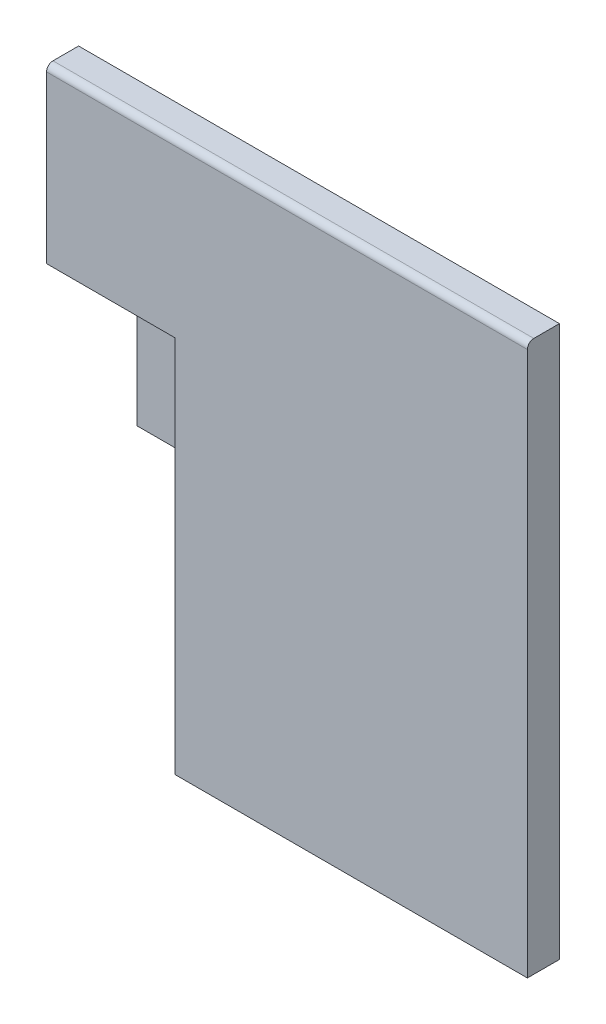
ISO-10303-21;
HEADER;
FILE_DESCRIPTION(('STEP AP214'),'2;1');
FILE_NAME('part.step','',(''),(''),'','','');
FILE_SCHEMA(('AUTOMOTIVE_DESIGN { 1 0 10303 214 1 1 1 1 }'));
ENDSEC;
DATA;
#1=APPLICATION_CONTEXT('core data for automotive mechanical design processes');
#2=APPLICATION_PROTOCOL_DEFINITION('international standard','automotive_design',2000,#1);
#3=PRODUCT_CONTEXT('',#1,'mechanical');
#4=PRODUCT('Part','Part','',(#3));
#5=PRODUCT_RELATED_PRODUCT_CATEGORY('part','',(#4));
#6=PRODUCT_DEFINITION_FORMATION('','',#4);
#7=PRODUCT_DEFINITION_CONTEXT('part definition',#1,'design');
#8=PRODUCT_DEFINITION('design','',#6,#7);
#9=PRODUCT_DEFINITION_SHAPE('','',#8);
#10=(LENGTH_UNIT() NAMED_UNIT(*) SI_UNIT(.MILLI.,.METRE.));
#11=(NAMED_UNIT(*) PLANE_ANGLE_UNIT() SI_UNIT($,.RADIAN.));
#12=(NAMED_UNIT(*) SI_UNIT($,.STERADIAN.) SOLID_ANGLE_UNIT());
#13=UNCERTAINTY_MEASURE_WITH_UNIT(LENGTH_MEASURE(1.E-05),#10,'distance_accuracy_value','');
#14=(GEOMETRIC_REPRESENTATION_CONTEXT(3) GLOBAL_UNCERTAINTY_ASSIGNED_CONTEXT((#13)) GLOBAL_UNIT_ASSIGNED_CONTEXT((#10,
#11,#12)) REPRESENTATION_CONTEXT('',''));
#15=CARTESIAN_POINT('',(0.,0.,0.));
#16=DIRECTION('',(0.,0.,1.));
#17=DIRECTION('',(1.,0.,0.));
#18=AXIS2_PLACEMENT_3D('',#15,#16,#17);
#19=CARTESIAN_POINT('',(0.,0.,-33.2842712474619));
#20=DIRECTION('',(0.,1.,0.));
#21=DIRECTION('',(0.,0.,-1.));
#22=AXIS2_PLACEMENT_3D('',#19,#20,#21);
#23=PLANE('',#22);
#24=DIRECTION('',(-1.,0.,0.));
#25=VECTOR('',#24,1.);
#26=CARTESIAN_POINT('',(75.,0.,-19.1421356237309));
#27=LINE('',#26,#25);
#28=CARTESIAN_POINT('',(30.0000000000001,0.,-19.1421356237309));
#29=VERTEX_POINT('',#28);
#30=CARTESIAN_POINT('',(20.,0.,-19.1421356237309));
#31=VERTEX_POINT('',#30);
#32=EDGE_CURVE('E11',#29,#31,#27,.T.);
#33=ORIENTED_EDGE('',*,*,#32,.T.);
#34=DIRECTION('',(0.,0.,-1.));
#35=VECTOR('',#34,1.);
#36=CARTESIAN_POINT('',(20.,0.,-14.142135623731));
#37=LINE('',#36,#35);
#38=CARTESIAN_POINT('',(20.,0.,-28.2842712474619));
#39=VERTEX_POINT('',#38);
#40=EDGE_CURVE('E189',#31,#39,#37,.T.);
#41=ORIENTED_EDGE('',*,*,#40,.T.);
#42=DIRECTION('',(1.,0.,0.));
#43=VECTOR('',#42,1.);
#44=CARTESIAN_POINT('',(0.,0.,-28.2842712474619));
#45=LINE('',#44,#43);
#46=CARTESIAN_POINT('',(0.,0.,-28.2842712474619));
#47=VERTEX_POINT('',#46);
#48=EDGE_CURVE('E210',#47,#39,#45,.T.);
#49=ORIENTED_EDGE('',*,*,#48,.F.);
#50=DIRECTION('',(0.,0.,1.));
#51=VECTOR('',#50,1.);
#52=CARTESIAN_POINT('',(0.,0.,-33.2842712474619));
#53=LINE('',#52,#51);
#54=CARTESIAN_POINT('',(0.,0.,-33.2842712474619));
#55=VERTEX_POINT('',#54);
#56=EDGE_CURVE('E207',#55,#47,#53,.T.);
#57=ORIENTED_EDGE('',*,*,#56,.F.);
#58=DIRECTION('',(1.,0.,0.));
#59=VECTOR('',#58,1.);
#60=CARTESIAN_POINT('',(0.,0.,-33.2842712474619));
#61=LINE('',#60,#59);
#62=CARTESIAN_POINT('',(25.,0.,-33.2842712474619));
#63=VERTEX_POINT('',#62);
#64=EDGE_CURVE('E196',#55,#63,#61,.T.);
#65=ORIENTED_EDGE('',*,*,#64,.T.);
#66=DIRECTION('',(0.,0.,1.));
#67=VECTOR('',#66,1.);
#68=CARTESIAN_POINT('',(25.,0.,-33.2842712474619));
#69=LINE('',#68,#67);
#70=CARTESIAN_POINT('',(25.,0.,-24.1421356237309));
#71=VERTEX_POINT('',#70);
#72=EDGE_CURVE('E223',#63,#71,#69,.T.);
#73=ORIENTED_EDGE('',*,*,#72,.T.);
#74=DIRECTION('',(-0.707106781186552,0.,-0.707106781186543));
#75=VECTOR('',#74,1.);
#76=CARTESIAN_POINT('',(7.92893218813437,0.,-41.2132034355964));
#77=LINE('',#76,#75);
#78=EDGE_CURVE('E234',#29,#71,#77,.T.);
#79=ORIENTED_EDGE('',*,*,#78,.F.);
#80=EDGE_LOOP('',(#33,#41,#49,#57,#65,#73,#79));
#81=FACE_BOUND('',#80,.T.);
#82=ADVANCED_FACE('F43',(#81),#23,.F.);
#83=CARTESIAN_POINT('',(0.,0.,-28.2842712474619));
#84=DIRECTION('',(0.,0.,-1.));
#85=DIRECTION('',(1.,0.,0.));
#86=AXIS2_PLACEMENT_3D('',#83,#84,#85);
#87=PLANE('',#86);
#88=CARTESIAN_POINT('',(10.,10.,-28.2842712474619));
#89=DIRECTION('',(0.,0.,1.));
#90=DIRECTION('',(1.,0.,0.));
#91=AXIS2_PLACEMENT_3D('',#88,#89,#90);
#92=CIRCLE('',#91,2.65);
#93=CARTESIAN_POINT('',(12.65,10.,-28.2842712474619));
#94=VERTEX_POINT('',#93);
#95=EDGE_CURVE('E192',#94,#94,#92,.T.);
#96=ORIENTED_EDGE('',*,*,#95,.F.);
#97=EDGE_LOOP('',(#96));
#98=FACE_BOUND('',#97,.T.);
#99=DIRECTION('',(0.,1.,0.));
#100=VECTOR('',#99,1.);
#101=CARTESIAN_POINT('',(20.,15.,-28.2842712474619));
#102=LINE('',#101,#100);
#103=CARTESIAN_POINT('',(20.,15.,-28.2842712474619));
#104=VERTEX_POINT('',#103);
#105=EDGE_CURVE('E176',#39,#104,#102,.T.);
#106=ORIENTED_EDGE('',*,*,#105,.T.);
#107=DIRECTION('',(1.,0.,0.));
#108=VECTOR('',#107,1.);
#109=CARTESIAN_POINT('',(0.,15.,-28.2842712474619));
#110=LINE('',#109,#108);
#111=CARTESIAN_POINT('',(0.,15.,-28.2842712474619));
#112=VERTEX_POINT('',#111);
#113=EDGE_CURVE('E213',#112,#104,#110,.T.);
#114=ORIENTED_EDGE('',*,*,#113,.F.);
#115=DIRECTION('',(0.,1.,0.));
#116=VECTOR('',#115,1.);
#117=CARTESIAN_POINT('',(0.,0.,-28.2842712474619));
#118=LINE('',#117,#116);
#119=EDGE_CURVE('E197',#47,#112,#118,.T.);
#120=ORIENTED_EDGE('',*,*,#119,.F.);
#121=ORIENTED_EDGE('',*,*,#48,.T.);
#122=EDGE_LOOP('',(#106,#114,#120,#121));
#123=FACE_BOUND('',#122,.T.);
#124=ADVANCED_FACE('F314',(#98,#123),#87,.F.);
#125=CARTESIAN_POINT('',(25.,0.,-33.2842712474619));
#126=DIRECTION('',(1.,0.,0.));
#127=DIRECTION('',(0.,1.,0.));
#128=AXIS2_PLACEMENT_3D('',#125,#126,#127);
#129=PLANE('',#128);
#130=ORIENTED_EDGE('',*,*,#72,.F.);
#131=DIRECTION('',(0.,-1.,0.));
#132=VECTOR('',#131,1.);
#133=CARTESIAN_POINT('',(25.,0.,-33.2842712474619));
#134=LINE('',#133,#132);
#135=CARTESIAN_POINT('',(25.,15.,-33.2842712474619));
#136=VERTEX_POINT('',#135);
#137=EDGE_CURVE('E200',#136,#63,#134,.T.);
#138=ORIENTED_EDGE('',*,*,#137,.F.);
#139=DIRECTION('',(0.,0.703526470681449,0.710669054518701));
#140=VECTOR('',#139,1.);
#141=CARTESIAN_POINT('',(25.,29.,-19.142135623731));
#142=LINE('',#141,#140);
#143=CARTESIAN_POINT('',(25.,29.,-19.142135623731));
#144=VERTEX_POINT('',#143);
#145=EDGE_CURVE('E279',#136,#144,#142,.T.);
#146=ORIENTED_EDGE('',*,*,#145,.T.);
#147=DIRECTION('',(0.,-1.,0.));
#148=VECTOR('',#147,1.);
#149=CARTESIAN_POINT('',(25.,15.,-19.142135623731));
#150=LINE('',#149,#148);
#151=CARTESIAN_POINT('',(25.,24.0502525316942,-19.142135623731));
#152=VERTEX_POINT('',#151);
#153=EDGE_CURVE('E226',#144,#152,#150,.T.);
#154=ORIENTED_EDGE('',*,*,#153,.T.);
#155=DIRECTION('',(0.,-0.703526470681449,-0.710669054518701));
#156=VECTOR('',#155,1.);
#157=CARTESIAN_POINT('',(25.,15.,-28.2842712474619));
#158=LINE('',#157,#156);
#159=CARTESIAN_POINT('',(25.,15.,-28.2842712474619));
#160=VERTEX_POINT('',#159);
#161=EDGE_CURVE('E276',#152,#160,#158,.T.);
#162=ORIENTED_EDGE('',*,*,#161,.T.);
#163=DIRECTION('',(0.,0.,1.));
#164=VECTOR('',#163,1.);
#165=CARTESIAN_POINT('',(25.,15.,-33.2842712474619));
#166=LINE('',#165,#164);
#167=CARTESIAN_POINT('',(25.,15.,-24.1421356237309));
#168=VERTEX_POINT('',#167);
#169=EDGE_CURVE('E220',#160,#168,#166,.T.);
#170=ORIENTED_EDGE('',*,*,#169,.T.);
#171=DIRECTION('',(0.,1.,0.));
#172=VECTOR('',#171,1.);
#173=CARTESIAN_POINT('',(25.,0.,-24.1421356237309));
#174=LINE('',#173,#172);
#175=EDGE_CURVE('E231',#71,#168,#174,.T.);
#176=ORIENTED_EDGE('',*,*,#175,.F.);
#177=EDGE_LOOP('',(#130,#138,#146,#154,#162,#170,#176));
#178=FACE_BOUND('',#177,.T.);
#179=ADVANCED_FACE('F307',(#178),#129,.T.);
#180=CARTESIAN_POINT('',(0.,15.,-33.2842712474619));
#181=DIRECTION('',(0.,1.,0.));
#182=DIRECTION('',(0.,0.,-1.));
#183=AXIS2_PLACEMENT_3D('',#180,#181,#182);
#184=PLANE('',#183);
#185=DIRECTION('',(-1.,0.,0.));
#186=VECTOR('',#185,1.);
#187=CARTESIAN_POINT('',(48.7154244372162,15.,-28.2842712474619));
#188=LINE('',#187,#186);
#189=EDGE_CURVE('E273',#160,#104,#188,.T.);
#190=ORIENTED_EDGE('',*,*,#189,.T.);
#191=DIRECTION('',(0.,0.,-1.));
#192=VECTOR('',#191,1.);
#193=CARTESIAN_POINT('',(20.,15.,-14.142135623731));
#194=LINE('',#193,#192);
#195=CARTESIAN_POINT('',(20.,15.,-19.142135623731));
#196=VERTEX_POINT('',#195);
#197=EDGE_CURVE('E186',#196,#104,#194,.T.);
#198=ORIENTED_EDGE('',*,*,#197,.F.);
#199=DIRECTION('',(1.,0.,0.));
#200=VECTOR('',#199,1.);
#201=CARTESIAN_POINT('',(20.,15.,-19.142135623731));
#202=LINE('',#201,#200);
#203=CARTESIAN_POINT('',(30.,15.,-19.142135623731));
#204=VERTEX_POINT('',#203);
#205=EDGE_CURVE('E248',#196,#204,#202,.T.);
#206=ORIENTED_EDGE('',*,*,#205,.T.);
#207=DIRECTION('',(0.707106781186552,0.,0.707106781186543));
#208=VECTOR('',#207,1.);
#209=CARTESIAN_POINT('',(30.,15.,-19.142135623731));
#210=LINE('',#209,#208);
#211=EDGE_CURVE('E237',#168,#204,#210,.T.);
#212=ORIENTED_EDGE('',*,*,#211,.F.);
#213=ORIENTED_EDGE('',*,*,#169,.F.);
#214=EDGE_LOOP('',(#190,#198,#206,#212,#213));
#215=FACE_BOUND('',#214,.T.);
#216=ADVANCED_FACE('F304',(#215),#184,.T.);
#217=CARTESIAN_POINT('',(10.,10.,-33.2842712474619));
#218=DIRECTION('',(0.,0.,1.));
#219=DIRECTION('',(-1.,0.,0.));
#220=AXIS2_PLACEMENT_3D('',#217,#218,#219);
#221=CYLINDRICAL_SURFACE('',#220,2.65);
#222=CARTESIAN_POINT('',(10.,10.,-33.2842712474619));
#223=DIRECTION('',(0.,0.,1.));
#224=DIRECTION('',(1.,0.,0.));
#225=AXIS2_PLACEMENT_3D('',#222,#223,#224);
#226=CIRCLE('',#225,2.65);
#227=CARTESIAN_POINT('',(12.65,10.,-33.2842712474619));
#228=VERTEX_POINT('',#227);
#229=EDGE_CURVE('E193',#228,#228,#226,.T.);
#230=ORIENTED_EDGE('',*,*,#229,.F.);
#231=EDGE_LOOP('',(#230));
#232=FACE_BOUND('',#231,.T.);
#233=ORIENTED_EDGE('',*,*,#95,.T.);
#234=EDGE_LOOP('',(#233));
#235=FACE_BOUND('',#234,.T.);
#236=ADVANCED_FACE('F344',(#232,#235),#221,.F.);
#237=CARTESIAN_POINT('',(0.,0.,-33.2842712474619));
#238=DIRECTION('',(-1.,0.,0.));
#239=DIRECTION('',(0.,-1.,0.));
#240=AXIS2_PLACEMENT_3D('',#237,#238,#239);
#241=PLANE('',#240);
#242=DIRECTION('',(0.,0.,1.));
#243=VECTOR('',#242,1.);
#244=CARTESIAN_POINT('',(0.,55.9,-19.142135623731));
#245=LINE('',#244,#243);
#246=CARTESIAN_POINT('',(0.,55.9,-19.142135623731));
#247=VERTEX_POINT('',#246);
#248=CARTESIAN_POINT('',(0.,55.9,-15.1421356237309));
#249=VERTEX_POINT('',#248);
#250=EDGE_CURVE('E253',#247,#249,#245,.T.);
#251=ORIENTED_EDGE('',*,*,#250,.F.);
#252=DIRECTION('',(0.,1.,0.));
#253=VECTOR('',#252,1.);
#254=CARTESIAN_POINT('',(0.,29.,-19.142135623731));
#255=LINE('',#254,#253);
#256=CARTESIAN_POINT('',(0.,29.,-19.142135623731));
#257=VERTEX_POINT('',#256);
#258=EDGE_CURVE('E257',#257,#247,#255,.T.);
#259=ORIENTED_EDGE('',*,*,#258,.F.);
#260=DIRECTION('',(0.,0.703526470681449,0.710669054518701));
#261=VECTOR('',#260,1.);
#262=CARTESIAN_POINT('',(0.,29.,-19.142135623731));
#263=LINE('',#262,#261);
#264=CARTESIAN_POINT('',(0.,15.,-33.2842712474619));
#265=VERTEX_POINT('',#264);
#266=EDGE_CURVE('E283',#265,#257,#263,.T.);
#267=ORIENTED_EDGE('',*,*,#266,.F.);
#268=DIRECTION('',(0.,1.,0.));
#269=VECTOR('',#268,1.);
#270=CARTESIAN_POINT('',(0.,0.,-33.2842712474619));
#271=LINE('',#270,#269);
#272=EDGE_CURVE('E204',#55,#265,#271,.T.);
#273=ORIENTED_EDGE('',*,*,#272,.F.);
#274=ORIENTED_EDGE('',*,*,#56,.T.);
#275=ORIENTED_EDGE('',*,*,#119,.T.);
#276=DIRECTION('',(0.,-0.703526470681449,-0.710669054518701));
#277=VECTOR('',#276,1.);
#278=CARTESIAN_POINT('',(0.,15.,-28.2842712474619));
#279=LINE('',#278,#277);
#280=CARTESIAN_POINT('',(0.,29.,-14.142135623731));
#281=VERTEX_POINT('',#280);
#282=EDGE_CURVE('E282',#281,#112,#279,.T.);
#283=ORIENTED_EDGE('',*,*,#282,.F.);
#284=DIRECTION('',(0.,1.,0.));
#285=VECTOR('',#284,1.);
#286=CARTESIAN_POINT('',(0.,29.,-14.142135623731));
#287=LINE('',#286,#285);
#288=CARTESIAN_POINT('',(0.,54.9,-14.142135623731));
#289=VERTEX_POINT('',#288);
#290=EDGE_CURVE('E262',#281,#289,#287,.T.);
#291=ORIENTED_EDGE('',*,*,#290,.T.);
#292=CARTESIAN_POINT('',(0.,54.9,-15.1421356237309));
#293=DIRECTION('',(1.,0.,0.));
#294=DIRECTION('',(0.,-1.,0.));
#295=AXIS2_PLACEMENT_3D('',#292,#293,#294);
#296=CIRCLE('',#295,1.);
#297=EDGE_CURVE('E242',#249,#289,#296,.T.);
#298=ORIENTED_EDGE('',*,*,#297,.F.);
#299=EDGE_LOOP('',(#251,#259,#267,#273,#274,#275,#283,#291,#298));
#300=FACE_BOUND('',#299,.T.);
#301=ADVANCED_FACE('F323',(#300),#241,.T.);
#302=CARTESIAN_POINT('',(0.,0.,-33.2842712474619));
#303=DIRECTION('',(0.,0.,-1.));
#304=DIRECTION('',(1.,0.,0.));
#305=AXIS2_PLACEMENT_3D('',#302,#303,#304);
#306=PLANE('',#305);
#307=ORIENTED_EDGE('',*,*,#229,.T.);
#308=EDGE_LOOP('',(#307));
#309=FACE_BOUND('',#308,.T.);
#310=ORIENTED_EDGE('',*,*,#64,.F.);
#311=ORIENTED_EDGE('',*,*,#272,.T.);
#312=DIRECTION('',(1.,0.,0.));
#313=VECTOR('',#312,1.);
#314=CARTESIAN_POINT('',(0.,15.,-33.2842712474619));
#315=LINE('',#314,#313);
#316=EDGE_CURVE('E202',#265,#136,#315,.T.);
#317=ORIENTED_EDGE('',*,*,#316,.T.);
#318=ORIENTED_EDGE('',*,*,#137,.T.);
#319=EDGE_LOOP('',(#310,#311,#317,#318));
#320=FACE_BOUND('',#319,.T.);
#321=ADVANCED_FACE('F332',(#309,#320),#306,.T.);
#322=CARTESIAN_POINT('',(20.,15.,-14.142135623731));
#323=DIRECTION('',(1.,0.,0.));
#324=DIRECTION('',(0.,0.,1.));
#325=AXIS2_PLACEMENT_3D('',#322,#323,#324);
#326=PLANE('',#325);
#327=DIRECTION('',(0.,-1.,0.));
#328=VECTOR('',#327,1.);
#329=CARTESIAN_POINT('',(20.,55.9,-19.142135623731));
#330=LINE('',#329,#328);
#331=CARTESIAN_POINT('',(20.,24.0502525316942,-19.142135623731));
#332=VERTEX_POINT('',#331);
#333=EDGE_CURVE('E181',#332,#196,#330,.T.);
#334=ORIENTED_EDGE('',*,*,#333,.T.);
#335=ORIENTED_EDGE('',*,*,#197,.T.);
#336=ORIENTED_EDGE('',*,*,#105,.F.);
#337=ORIENTED_EDGE('',*,*,#40,.F.);
#338=DIRECTION('',(0.,1.,0.));
#339=VECTOR('',#338,1.);
#340=CARTESIAN_POINT('',(20.,-30.,-19.1421356237309));
#341=LINE('',#340,#339);
#342=CARTESIAN_POINT('',(20.,-30.,-19.1421356237309));
#343=VERTEX_POINT('',#342);
#344=EDGE_CURVE('E286',#343,#31,#341,.T.);
#345=ORIENTED_EDGE('',*,*,#344,.F.);
#346=DIRECTION('',(0.,0.,1.));
#347=VECTOR('',#346,1.);
#348=CARTESIAN_POINT('',(20.,-30.,-14.142135623731));
#349=LINE('',#348,#347);
#350=CARTESIAN_POINT('',(20.,-30.,-14.142135623731));
#351=VERTEX_POINT('',#350);
#352=EDGE_CURVE('E168',#343,#351,#349,.T.);
#353=ORIENTED_EDGE('',*,*,#352,.T.);
#354=DIRECTION('',(0.,1.,0.));
#355=VECTOR('',#354,1.);
#356=CARTESIAN_POINT('',(20.,15.,-14.142135623731));
#357=LINE('',#356,#355);
#358=CARTESIAN_POINT('',(20.,29.,-14.142135623731));
#359=VERTEX_POINT('',#358);
#360=EDGE_CURVE('E179',#351,#359,#357,.T.);
#361=ORIENTED_EDGE('',*,*,#360,.T.);
#362=DIRECTION('',(0.,0.703526470681449,0.710669054518701));
#363=VECTOR('',#362,1.);
#364=CARTESIAN_POINT('',(20.,22.0707070707071,-21.1417785082038));
#365=LINE('',#364,#363);
#366=EDGE_CURVE('E266',#332,#359,#365,.T.);
#367=ORIENTED_EDGE('',*,*,#366,.F.);
#368=EDGE_LOOP('',(#334,#335,#336,#337,#345,#353,#361,#367));
#369=FACE_BOUND('',#368,.T.);
#370=ADVANCED_FACE('F292',(#369),#326,.F.);
#371=CARTESIAN_POINT('',(0.,0.,-14.142135623731));
#372=DIRECTION('',(0.,0.,1.));
#373=DIRECTION('',(-1.,0.,0.));
#374=AXIS2_PLACEMENT_3D('',#371,#372,#373);
#375=PLANE('',#374);
#376=ORIENTED_EDGE('',*,*,#290,.F.);
#377=DIRECTION('',(-1.,0.,0.));
#378=VECTOR('',#377,1.);
#379=CARTESIAN_POINT('',(20.,29.,-14.142135623731));
#380=LINE('',#379,#378);
#381=EDGE_CURVE('E265',#359,#281,#380,.T.);
#382=ORIENTED_EDGE('',*,*,#381,.F.);
#383=ORIENTED_EDGE('',*,*,#360,.F.);
#384=DIRECTION('',(1.,0.,0.));
#385=VECTOR('',#384,1.);
#386=CARTESIAN_POINT('',(75.,-30.,-14.142135623731));
#387=LINE('',#386,#385);
#388=CARTESIAN_POINT('',(75.,-30.,-14.142135623731));
#389=VERTEX_POINT('',#388);
#390=EDGE_CURVE('E288',#351,#389,#387,.T.);
#391=ORIENTED_EDGE('',*,*,#390,.T.);
#392=DIRECTION('',(0.,1.,0.));
#393=VECTOR('',#392,1.);
#394=CARTESIAN_POINT('',(75.,15.,-14.142135623731));
#395=LINE('',#394,#393);
#396=CARTESIAN_POINT('',(75.,54.9,-14.142135623731));
#397=VERTEX_POINT('',#396);
#398=EDGE_CURVE('E160',#389,#397,#395,.T.);
#399=ORIENTED_EDGE('',*,*,#398,.T.);
#400=DIRECTION('',(-1.,0.,0.));
#401=VECTOR('',#400,1.);
#402=CARTESIAN_POINT('',(75.,54.9,-14.142135623731));
#403=LINE('',#402,#401);
#404=EDGE_CURVE('E65',#289,#397,#403,.F.);
#405=ORIENTED_EDGE('',*,*,#404,.F.);
#406=EDGE_LOOP('',(#376,#382,#383,#391,#399,#405));
#407=FACE_BOUND('',#406,.T.);
#408=ADVANCED_FACE('F324',(#407),#375,.T.);
#409=CARTESIAN_POINT('',(75.,15.,-19.142135623731));
#410=DIRECTION('',(0.,0.,1.));
#411=DIRECTION('',(0.,1.,0.));
#412=AXIS2_PLACEMENT_3D('',#409,#410,#411);
#413=PLANE('',#412);
#414=ORIENTED_EDGE('',*,*,#205,.F.);
#415=ORIENTED_EDGE('',*,*,#333,.F.);
#416=DIRECTION('',(-1.,0.,0.));
#417=VECTOR('',#416,1.);
#418=CARTESIAN_POINT('',(75.,24.0502525316942,-19.142135623731));
#419=LINE('',#418,#417);
#420=EDGE_CURVE('E271',#152,#332,#419,.T.);
#421=ORIENTED_EDGE('',*,*,#420,.F.);
#422=ORIENTED_EDGE('',*,*,#153,.F.);
#423=DIRECTION('',(-1.,0.,0.));
#424=VECTOR('',#423,1.);
#425=CARTESIAN_POINT('',(20.,29.,-19.142135623731));
#426=LINE('',#425,#424);
#427=EDGE_CURVE('E259',#144,#257,#426,.T.);
#428=ORIENTED_EDGE('',*,*,#427,.T.);
#429=ORIENTED_EDGE('',*,*,#258,.T.);
#430=DIRECTION('',(1.,0.,0.));
#431=VECTOR('',#430,1.);
#432=CARTESIAN_POINT('',(20.,55.9,-19.142135623731));
#433=LINE('',#432,#431);
#434=CARTESIAN_POINT('',(75.,55.9,-19.142135623731));
#435=VERTEX_POINT('',#434);
#436=EDGE_CURVE('E175',#247,#435,#433,.T.);
#437=ORIENTED_EDGE('',*,*,#436,.T.);
#438=DIRECTION('',(0.,-1.,0.));
#439=VECTOR('',#438,1.);
#440=CARTESIAN_POINT('',(75.,15.,-19.142135623731));
#441=LINE('',#440,#439);
#442=CARTESIAN_POINT('',(75.,-30.,-19.1421356237309));
#443=VERTEX_POINT('',#442);
#444=EDGE_CURVE('E158',#435,#443,#441,.T.);
#445=ORIENTED_EDGE('',*,*,#444,.T.);
#446=DIRECTION('',(-1.,0.,0.));
#447=VECTOR('',#446,1.);
#448=CARTESIAN_POINT('',(75.,-30.,-19.1421356237309));
#449=LINE('',#448,#447);
#450=EDGE_CURVE('E163',#443,#343,#449,.T.);
#451=ORIENTED_EDGE('',*,*,#450,.T.);
#452=ORIENTED_EDGE('',*,*,#344,.T.);
#453=ORIENTED_EDGE('',*,*,#32,.F.);
#454=DIRECTION('',(0.,-1.,0.));
#455=VECTOR('',#454,1.);
#456=CARTESIAN_POINT('',(30.,15.,-19.142135623731));
#457=LINE('',#456,#455);
#458=EDGE_CURVE('E229',#204,#29,#457,.T.);
#459=ORIENTED_EDGE('',*,*,#458,.F.);
#460=EDGE_LOOP('',(#414,#415,#421,#422,#428,#429,#437,#445,#451,#452,#453,#459));
#461=FACE_BOUND('',#460,.T.);
#462=ADVANCED_FACE('F173',(#461),#413,.F.);
#463=CARTESIAN_POINT('',(75.,0.,-28.2842712474619));
#464=DIRECTION('',(-1.,0.,0.));
#465=DIRECTION('',(0.,-1.,0.));
#466=AXIS2_PLACEMENT_3D('',#463,#464,#465);
#467=PLANE('',#466);
#468=ORIENTED_EDGE('',*,*,#398,.F.);
#469=DIRECTION('',(0.,0.,-1.));
#470=VECTOR('',#469,1.);
#471=CARTESIAN_POINT('',(75.,-30.,-14.142135623731));
#472=LINE('',#471,#470);
#473=EDGE_CURVE('E154',#389,#443,#472,.T.);
#474=ORIENTED_EDGE('',*,*,#473,.T.);
#475=ORIENTED_EDGE('',*,*,#444,.F.);
#476=DIRECTION('',(0.,0.,1.));
#477=VECTOR('',#476,1.);
#478=CARTESIAN_POINT('',(75.,55.9,-19.142135623731));
#479=LINE('',#478,#477);
#480=CARTESIAN_POINT('',(75.,55.9,-15.1421356237309));
#481=VERTEX_POINT('',#480);
#482=EDGE_CURVE('E245',#435,#481,#479,.T.);
#483=ORIENTED_EDGE('',*,*,#482,.T.);
#484=CARTESIAN_POINT('',(75.,54.9,-15.1421356237309));
#485=DIRECTION('',(1.,0.,0.));
#486=DIRECTION('',(0.,-1.,0.));
#487=AXIS2_PLACEMENT_3D('',#484,#485,#486);
#488=CIRCLE('',#487,1.);
#489=EDGE_CURVE('E47',#397,#481,#488,.F.);
#490=ORIENTED_EDGE('',*,*,#489,.F.);
#491=EDGE_LOOP('',(#468,#474,#475,#483,#490));
#492=FACE_BOUND('',#491,.T.);
#493=ADVANCED_FACE('F156',(#492),#467,.F.);
#494=CARTESIAN_POINT('',(0.,55.9,-28.2842712474619));
#495=DIRECTION('',(0.,-1.,0.));
#496=DIRECTION('',(0.,0.,1.));
#497=AXIS2_PLACEMENT_3D('',#494,#495,#496);
#498=PLANE('',#497);
#499=ORIENTED_EDGE('',*,*,#482,.F.);
#500=ORIENTED_EDGE('',*,*,#436,.F.);
#501=ORIENTED_EDGE('',*,*,#250,.T.);
#502=DIRECTION('',(-1.,0.,0.));
#503=VECTOR('',#502,1.);
#504=CARTESIAN_POINT('',(0.,55.9,-15.1421356237309));
#505=LINE('',#504,#503);
#506=EDGE_CURVE('E240',#481,#249,#505,.T.);
#507=ORIENTED_EDGE('',*,*,#506,.F.);
#508=EDGE_LOOP('',(#499,#500,#501,#507));
#509=FACE_BOUND('',#508,.T.);
#510=ADVANCED_FACE('F356',(#509),#498,.F.);
#511=CARTESIAN_POINT('',(48.7154244372162,15.,-28.2842712474619));
#512=DIRECTION('',(0.,-0.710669054518701,0.703526470681449));
#513=DIRECTION('',(0.,0.703526470681449,0.710669054518701));
#514=AXIS2_PLACEMENT_3D('',#511,#512,#513);
#515=PLANE('',#514);
#516=ORIENTED_EDGE('',*,*,#366,.T.);
#517=ORIENTED_EDGE('',*,*,#381,.T.);
#518=ORIENTED_EDGE('',*,*,#282,.T.);
#519=ORIENTED_EDGE('',*,*,#113,.T.);
#520=ORIENTED_EDGE('',*,*,#189,.F.);
#521=ORIENTED_EDGE('',*,*,#161,.F.);
#522=ORIENTED_EDGE('',*,*,#420,.T.);
#523=EDGE_LOOP('',(#516,#517,#518,#519,#520,#521,#522));
#524=FACE_BOUND('',#523,.T.);
#525=ADVANCED_FACE('F310',(#524),#515,.T.);
#526=CARTESIAN_POINT('',(48.7154244372162,29.,-19.142135623731));
#527=DIRECTION('',(0.,0.710669054518701,-0.703526470681449));
#528=DIRECTION('',(0.,-0.703526470681449,-0.710669054518701));
#529=AXIS2_PLACEMENT_3D('',#526,#527,#528);
#530=PLANE('',#529);
#531=ORIENTED_EDGE('',*,*,#316,.F.);
#532=ORIENTED_EDGE('',*,*,#266,.T.);
#533=ORIENTED_EDGE('',*,*,#427,.F.);
#534=ORIENTED_EDGE('',*,*,#145,.F.);
#535=EDGE_LOOP('',(#531,#532,#533,#534));
#536=FACE_BOUND('',#535,.T.);
#537=ADVANCED_FACE('F319',(#536),#530,.T.);
#538=CARTESIAN_POINT('',(30.,15.,-19.142135623731));
#539=DIRECTION('',(-0.707106781186543,0.,0.707106781186552));
#540=DIRECTION('',(0.,-1.,0.));
#541=AXIS2_PLACEMENT_3D('',#538,#539,#540);
#542=PLANE('',#541);
#543=ORIENTED_EDGE('',*,*,#211,.T.);
#544=ORIENTED_EDGE('',*,*,#458,.T.);
#545=ORIENTED_EDGE('',*,*,#78,.T.);
#546=ORIENTED_EDGE('',*,*,#175,.T.);
#547=EDGE_LOOP('',(#543,#544,#545,#546));
#548=FACE_BOUND('',#547,.T.);
#549=ADVANCED_FACE('F302',(#548),#542,.F.);
#550=CARTESIAN_POINT('',(0.,54.9,-15.1421356237309));
#551=DIRECTION('',(1.,0.,0.));
#552=DIRECTION('',(0.,0.,1.));
#553=AXIS2_PLACEMENT_3D('',#550,#551,#552);
#554=CYLINDRICAL_SURFACE('',#553,1.);
#555=ORIENTED_EDGE('',*,*,#489,.T.);
#556=ORIENTED_EDGE('',*,*,#506,.T.);
#557=ORIENTED_EDGE('',*,*,#297,.T.);
#558=ORIENTED_EDGE('',*,*,#404,.T.);
#559=EDGE_LOOP('',(#555,#556,#557,#558));
#560=FACE_BOUND('',#559,.T.);
#561=ADVANCED_FACE('F45',(#560),#554,.T.);
#562=CARTESIAN_POINT('',(0.,-30.,-28.2842712474619));
#563=DIRECTION('',(0.,-1.,0.));
#564=DIRECTION('',(0.,0.,1.));
#565=AXIS2_PLACEMENT_3D('',#562,#563,#564);
#566=PLANE('',#565);
#567=ORIENTED_EDGE('',*,*,#473,.F.);
#568=ORIENTED_EDGE('',*,*,#390,.F.);
#569=ORIENTED_EDGE('',*,*,#352,.F.);
#570=ORIENTED_EDGE('',*,*,#450,.F.);
#571=EDGE_LOOP('',(#567,#568,#569,#570));
#572=FACE_BOUND('',#571,.T.);
#573=ADVANCED_FACE('F166',(#572),#566,.T.);
#574=CLOSED_SHELL('',(#82,#124,#179,#216,#236,#301,#321,#370,#408,#462,#493,#510,#525,#537,#549,
#561,#573));
#575=MANIFOLD_SOLID_BREP('B2',#574);
#576=ADVANCED_BREP_SHAPE_REPRESENTATION('',(#18,#575),#14);
#577=SHAPE_DEFINITION_REPRESENTATION(#9,#576);
ENDSEC;
END-ISO-10303-21;
